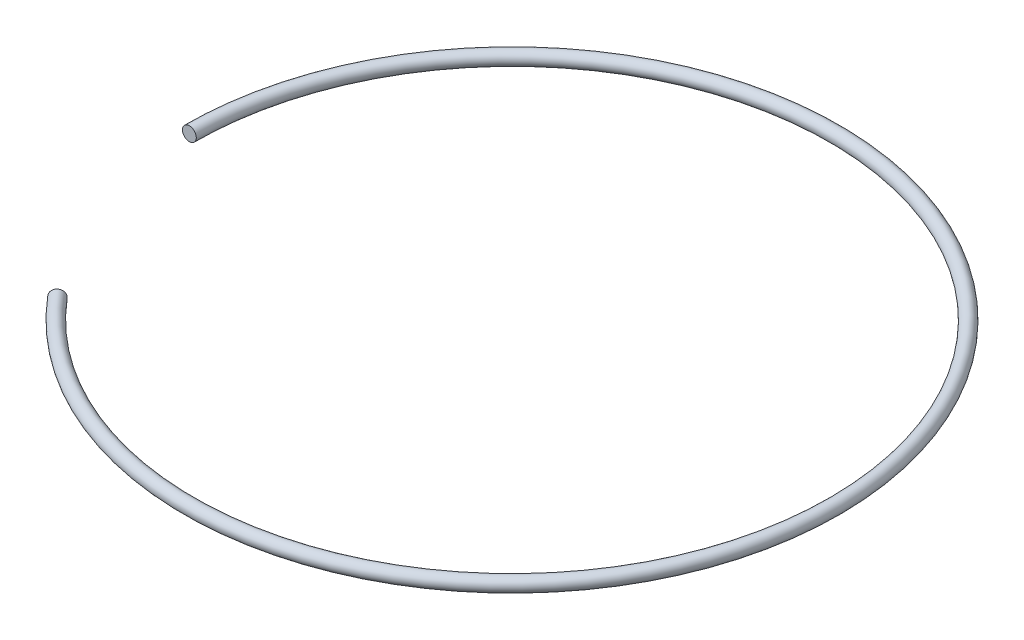
ISO-10303-21;
HEADER;
FILE_DESCRIPTION(('STEP AP214'),'2;1');
FILE_NAME('part.step','',(''),(''),'','','');
FILE_SCHEMA(('AUTOMOTIVE_DESIGN { 1 0 10303 214 1 1 1 1 }'));
ENDSEC;
DATA;
#1=APPLICATION_CONTEXT('core data for automotive mechanical design processes');
#2=APPLICATION_PROTOCOL_DEFINITION('international standard','automotive_design',2000,#1);
#3=PRODUCT_CONTEXT('',#1,'mechanical');
#4=PRODUCT('Part','Part','',(#3));
#5=PRODUCT_RELATED_PRODUCT_CATEGORY('part','',(#4));
#6=PRODUCT_DEFINITION_FORMATION('','',#4);
#7=PRODUCT_DEFINITION_CONTEXT('part definition',#1,'design');
#8=PRODUCT_DEFINITION('design','',#6,#7);
#9=PRODUCT_DEFINITION_SHAPE('','',#8);
#10=(LENGTH_UNIT() NAMED_UNIT(*) SI_UNIT(.MILLI.,.METRE.));
#11=(NAMED_UNIT(*) PLANE_ANGLE_UNIT() SI_UNIT($,.RADIAN.));
#12=(NAMED_UNIT(*) SI_UNIT($,.STERADIAN.) SOLID_ANGLE_UNIT());
#13=UNCERTAINTY_MEASURE_WITH_UNIT(LENGTH_MEASURE(1.E-05),#10,'distance_accuracy_value','');
#14=(GEOMETRIC_REPRESENTATION_CONTEXT(3) GLOBAL_UNCERTAINTY_ASSIGNED_CONTEXT((#13)) GLOBAL_UNIT_ASSIGNED_CONTEXT((#10,
#11,#12)) REPRESENTATION_CONTEXT('',''));
#15=CARTESIAN_POINT('',(0.,0.,0.));
#16=DIRECTION('',(0.,0.,1.));
#17=DIRECTION('',(1.,0.,0.));
#18=AXIS2_PLACEMENT_3D('',#15,#16,#17);
#19=CARTESIAN_POINT('',(0.,0.,0.));
#20=DIRECTION('',(0.64278760968653,0.,0.766044443118986));
#21=DIRECTION('',(0.766044443118986,0.,-0.64278760968653));
#22=AXIS2_PLACEMENT_3D('',#19,#20,#21);
#23=PLANE('',#22);
#24=CARTESIAN_POINT('',(-5.24012141820206,3.56,4.3969839493374));
#25=CARTESIAN_POINT('',(-5.24012956112808,3.57680750835501,4.39699078206363));
#26=CARTESIAN_POINT('',(-5.24232409061338,3.59371844128931,4.39883221094534));
#27=CARTESIAN_POINT('',(-5.25087360078001,3.62558323599696,4.4060061017729));
#28=CARTESIAN_POINT('',(-5.25722858146136,3.64053709777029,4.41133856371876));
#29=CARTESIAN_POINT('',(-5.27337311327247,3.66687074596776,4.424885434407));
#30=CARTESIAN_POINT('',(-5.28316266440233,3.67825053239179,4.43309984314945));
#31=CARTESIAN_POINT('',(-5.30507516438556,3.6961346650492,4.45148661380356));
#32=CARTESIAN_POINT('',(-5.31719811323893,3.70263901128258,4.46165897571522));
#33=CARTESIAN_POINT('',(-5.34240994341579,3.71004353855515,4.48281421311792));
#34=CARTESIAN_POINT('',(-5.35549882473928,3.71094371959435,4.49379708860897));
#35=CARTESIAN_POINT('',(-5.38116710180032,3.70703844536533,4.51533533042384));
#36=CARTESIAN_POINT('',(-5.39374649753788,3.70223299009711,4.52589069674766));
#37=CARTESIAN_POINT('',(-5.41697725061752,3.68745356130633,4.54538361308875));
#38=CARTESIAN_POINT('',(-5.4276286079596,3.67747958778377,4.55432116310603));
#39=CARTESIAN_POINT('',(-5.44580345594018,3.65350623717002,4.56957167134324));
#40=CARTESIAN_POINT('',(-5.45332694657869,3.63950686007882,4.57588462956318));
#41=CARTESIAN_POINT('',(-5.46439404028407,3.60899118714949,4.58517102380957));
#42=CARTESIAN_POINT('',(-5.46793764335095,3.59247489131134,4.58814445983603));
#43=CARTESIAN_POINT('',(-5.46972514168804,3.57052398291492,4.58964434903141));
#44=CARTESIAN_POINT('',(-5.46993730293539,3.5652670698381,4.58982237345581));
#45=CARTESIAN_POINT('',(-5.46992660821173,3.54319249164499,4.58981339951714));
#46=CARTESIAN_POINT('',(-5.46773207872644,3.52628155871068,4.58797197063542));
#47=CARTESIAN_POINT('',(-5.45918256855981,3.49441676400304,4.58079807980785));
#48=CARTESIAN_POINT('',(-5.45282758787846,3.4794629022297,4.575465617862));
#49=CARTESIAN_POINT('',(-5.43668305606735,3.45312925403224,4.56191874717376));
#50=CARTESIAN_POINT('',(-5.4268935049375,3.4417494676082,4.55370433843131));
#51=CARTESIAN_POINT('',(-5.40498100495426,3.42386533495079,4.5353175677772));
#52=CARTESIAN_POINT('',(-5.39285805610088,3.41736098871742,4.52514520586555));
#53=CARTESIAN_POINT('',(-5.36764622592402,3.40995646144485,4.50398996846284));
#54=CARTESIAN_POINT('',(-5.35455734460054,3.40905628040565,4.49300709297179));
#55=CARTESIAN_POINT('',(-5.3288890675395,3.41296155463467,4.47146885115692));
#56=CARTESIAN_POINT('',(-5.31630967180194,3.41776700990289,4.4609134848331));
#57=CARTESIAN_POINT('',(-5.2930789187223,3.43254643869366,4.441420568492));
#58=CARTESIAN_POINT('',(-5.28242756138022,3.44252041221623,4.43248301847473));
#59=CARTESIAN_POINT('',(-5.26425271339964,3.46649376282998,4.41723251023751));
#60=CARTESIAN_POINT('',(-5.25672922276113,3.48049313992117,4.41091955201758));
#61=CARTESIAN_POINT('',(-5.24566212905575,3.51100881285051,4.40163315777118));
#62=CARTESIAN_POINT('',(-5.24211852598886,3.52752510868866,4.39865972174473));
#63=CARTESIAN_POINT('',(-5.24033102765178,3.54947601708507,4.39715983254935));
#64=CARTESIAN_POINT('',(-5.24011886640443,3.5547329301619,4.39698180812495));
#65=CARTESIAN_POINT('',(-5.24012141820206,3.56,4.3969839493374));
#66=B_SPLINE_CURVE_WITH_KNOTS('',3,(#24,#25,#26,#27,#28,#29,#30,#31,#32,#33,#34,#35,#36,#37,#38,
#39,#40,#41,#42,#43,#44,#45,#46,#47,#48,#49,#50,#51,#52,#53,#54,#55,#56,#57,#58,#59,#60,#61,#62,
#63,#64,#65),.UNSPECIFIED.,.T.,.F.,(4,2,2,2,2,2,2,2,2,2,2,2,2,2,2,2,2,2,2,2,4),(0.,
0.0503657057955506,0.100731411591101,0.151097117387924,0.201462823184746,0.251828528981566,
0.302194234778387,0.352559940575211,0.402925646372033,0.453291352168854,0.469074755887428,
0.51944046168298,0.569806167478531,0.620171873275353,0.670537579072176,0.720903284868996,
0.771268990665819,0.821634696462641,0.872000402259462,0.922366108056284,0.938149511774858),.UNSPECIFIED.);
#67=CARTESIAN_POINT('',(-5.24012141820206,3.56,4.3969839493374));
#68=VERTEX_POINT('',#67);
#69=EDGE_CURVE('E18',#68,#68,#66,.T.);
#70=ORIENTED_EDGE('',*,*,#69,.F.);
#71=EDGE_LOOP('',(#70));
#72=FACE_BOUND('',#71,.T.);
#73=ADVANCED_FACE('F14',(#72),#23,.F.);
#74=CARTESIAN_POINT('',(0.,0.,0.));
#75=DIRECTION('',(0.,0.,1.));
#76=DIRECTION('',(1.,0.,0.));
#77=AXIS2_PLACEMENT_3D('',#74,#75,#76);
#78=PLANE('',#77);
#79=CARTESIAN_POINT('',(-7.14049269630709,3.56,0.));
#80=CARTESIAN_POINT('',(-7.1404820664721,3.57680750835501,0.));
#81=CARTESIAN_POINT('',(-7.13761731168535,3.59371844128931,0.));
#82=CARTESIAN_POINT('',(-7.12645671879361,3.62558323599696,0.));
#83=CARTESIAN_POINT('',(-7.11816088068861,3.64053709777029,0.));
#84=CARTESIAN_POINT('',(-7.09708569117953,3.66687074596776,0.));
#85=CARTESIAN_POINT('',(-7.08430633977533,3.67825053239179,0.));
#86=CARTESIAN_POINT('',(-7.05570160256972,3.6961346650492,0.));
#87=CARTESIAN_POINT('',(-7.03987621676831,3.70263901128258,0.));
#88=CARTESIAN_POINT('',(-7.00696450987803,3.71004353855515,0.));
#89=CARTESIAN_POINT('',(-6.98987818878916,3.71094371959435,0.));
#90=CARTESIAN_POINT('',(-6.95637063280908,3.70703844536533,0.));
#91=CARTESIAN_POINT('',(-6.93994939791787,3.70223299009711,0.));
#92=CARTESIAN_POINT('',(-6.90962380351103,3.68745356130633,0.));
#93=CARTESIAN_POINT('',(-6.8957194439954,3.67747958778377,0.));
#94=CARTESIAN_POINT('',(-6.87199386495904,3.65350623717002,0.));
#95=CARTESIAN_POINT('',(-6.86217264543831,3.63950686007882,0.));
#96=CARTESIAN_POINT('',(-6.84772558064357,3.60899118714949,0.));
#97=CARTESIAN_POINT('',(-6.84309973536957,3.59247489131134,0.));
#98=CARTESIAN_POINT('',(-6.84076632201067,3.57052398291492,0.));
#99=CARTESIAN_POINT('',(-6.84048936517186,3.5652670698381,0.));
#100=CARTESIAN_POINT('',(-6.84050332614208,3.54319249164499,0.));
#101=CARTESIAN_POINT('',(-6.84336808092883,3.52628155871068,0.));
#102=CARTESIAN_POINT('',(-6.85452867382058,3.49441676400304,0.));
#103=CARTESIAN_POINT('',(-6.86282451192557,3.4794629022297,0.));
#104=CARTESIAN_POINT('',(-6.88389970143466,3.45312925403224,0.));
#105=CARTESIAN_POINT('',(-6.89667905283886,3.4417494676082,0.));
#106=CARTESIAN_POINT('',(-6.92528379004447,3.42386533495079,0.));
#107=CARTESIAN_POINT('',(-6.94110917584588,3.41736098871742,0.));
#108=CARTESIAN_POINT('',(-6.97402088273616,3.40995646144485,0.));
#109=CARTESIAN_POINT('',(-6.99110720382503,3.40905628040565,0.));
#110=CARTESIAN_POINT('',(-7.02461475980511,3.41296155463467,0.));
#111=CARTESIAN_POINT('',(-7.04103599469632,3.41776700990289,0.));
#112=CARTESIAN_POINT('',(-7.07136158910315,3.43254643869366,0.));
#113=CARTESIAN_POINT('',(-7.08526594861879,3.44252041221623,0.));
#114=CARTESIAN_POINT('',(-7.10899152765515,3.46649376282998,0.));
#115=CARTESIAN_POINT('',(-7.11881274717588,3.48049313992117,0.));
#116=CARTESIAN_POINT('',(-7.13325981197061,3.51100881285051,0.));
#117=CARTESIAN_POINT('',(-7.13788565724462,3.52752510868866,0.));
#118=CARTESIAN_POINT('',(-7.14021907060352,3.54947601708507,0.));
#119=CARTESIAN_POINT('',(-7.14049602744233,3.5547329301619,0.));
#120=CARTESIAN_POINT('',(-7.14049269630709,3.56,0.));
#121=B_SPLINE_CURVE_WITH_KNOTS('',3,(#79,#80,#81,#82,#83,#84,#85,#86,#87,#88,#89,#90,#91,#92,
#93,#94,#95,#96,#97,#98,#99,#100,#101,#102,#103,#104,#105,#106,#107,#108,#109,#110,#111,#112,
#113,#114,#115,#116,#117,#118,#119,#120),.UNSPECIFIED.,.T.,.F.,(4,2,2,2,2,2,2,2,2,2,2,2,2,2,2,2,
2,2,2,2,4),(0.,0.0503657057955509,0.100731411591101,0.151097117387923,0.201462823184745,
0.251828528981567,0.302194234778389,0.352559940575211,0.402925646372033,0.453291352168855,
0.469074755887429,0.51944046168298,0.569806167478531,0.620171873275353,0.670537579072175,
0.720903284868997,0.771268990665819,0.82163469646264,0.872000402259462,0.922366108056284,
0.938149511774859),.UNSPECIFIED.);
#122=CARTESIAN_POINT('',(-7.14049269630709,3.56,0.));
#123=VERTEX_POINT('',#122);
#124=EDGE_CURVE('E10',#123,#123,#121,.T.);
#125=ORIENTED_EDGE('',*,*,#124,.F.);
#126=EDGE_LOOP('',(#125));
#127=FACE_BOUND('',#126,.T.);
#128=ADVANCED_FACE('F36',(#127),#78,.T.);
#129=CARTESIAN_POINT('',(0.,3.56,0.));
#130=DIRECTION('',(0.,1.,0.));
#131=DIRECTION('',(0.,0.,1.));
#132=AXIS2_PLACEMENT_3D('',#129,#130,#131);
#133=TOROIDAL_SURFACE('',#132,6.99049269630709,0.150000000000001);
#134=ORIENTED_EDGE('',*,*,#124,.T.);
#135=EDGE_LOOP('',(#134));
#136=FACE_BOUND('',#135,.T.);
#137=ORIENTED_EDGE('',*,*,#69,.T.);
#138=EDGE_LOOP('',(#137));
#139=FACE_BOUND('',#138,.T.);
#140=ADVANCED_FACE('F34',(#136,#139),#133,.T.);
#141=CLOSED_SHELL('',(#73,#128,#140));
#142=MANIFOLD_SOLID_BREP('B1',#141);
#143=ADVANCED_BREP_SHAPE_REPRESENTATION('',(#18,#142),#14);
#144=SHAPE_DEFINITION_REPRESENTATION(#9,#143);
ENDSEC;
END-ISO-10303-21;
